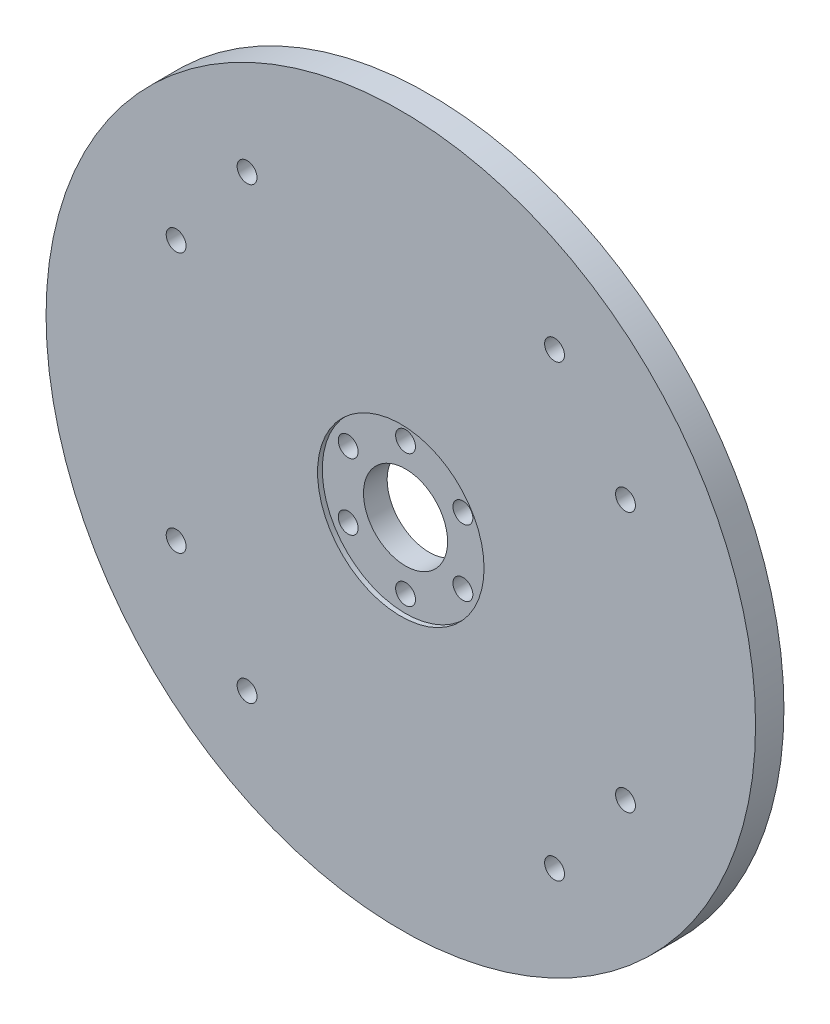
ISO-10303-21;
HEADER;
FILE_DESCRIPTION(('STEP AP214'),'2;1');
FILE_NAME('part.step','',(''),(''),'','','');
FILE_SCHEMA(('AUTOMOTIVE_DESIGN { 1 0 10303 214 1 1 1 1 }'));
ENDSEC;
DATA;
#1=APPLICATION_CONTEXT('core data for automotive mechanical design processes');
#2=APPLICATION_PROTOCOL_DEFINITION('international standard','automotive_design',2000,#1);
#3=PRODUCT_CONTEXT('',#1,'mechanical');
#4=PRODUCT('Part','Part','',(#3));
#5=PRODUCT_RELATED_PRODUCT_CATEGORY('part','',(#4));
#6=PRODUCT_DEFINITION_FORMATION('','',#4);
#7=PRODUCT_DEFINITION_CONTEXT('part definition',#1,'design');
#8=PRODUCT_DEFINITION('design','',#6,#7);
#9=PRODUCT_DEFINITION_SHAPE('','',#8);
#10=(LENGTH_UNIT() NAMED_UNIT(*) SI_UNIT(.MILLI.,.METRE.));
#11=(NAMED_UNIT(*) PLANE_ANGLE_UNIT() SI_UNIT($,.RADIAN.));
#12=(NAMED_UNIT(*) SI_UNIT($,.STERADIAN.) SOLID_ANGLE_UNIT());
#13=UNCERTAINTY_MEASURE_WITH_UNIT(LENGTH_MEASURE(1.E-05),#10,'distance_accuracy_value','');
#14=(GEOMETRIC_REPRESENTATION_CONTEXT(3) GLOBAL_UNCERTAINTY_ASSIGNED_CONTEXT((#13)) GLOBAL_UNIT_ASSIGNED_CONTEXT((#10,
#11,#12)) REPRESENTATION_CONTEXT('',''));
#15=CARTESIAN_POINT('',(0.,0.,0.));
#16=DIRECTION('',(0.,0.,1.));
#17=DIRECTION('',(1.,0.,0.));
#18=AXIS2_PLACEMENT_3D('',#15,#16,#17);
#19=CARTESIAN_POINT('',(-12.1243556529822,6.99999999999997,10.));
#20=DIRECTION('',(0.,0.,-1.));
#21=DIRECTION('',(-1.,0.,0.));
#22=AXIS2_PLACEMENT_3D('',#19,#20,#21);
#23=CYLINDRICAL_SURFACE('',#22,2.1);
#24=CARTESIAN_POINT('',(-12.1243556529822,6.99999999999997,0.999999999999999));
#25=DIRECTION('',(0.,0.,1.));
#26=DIRECTION('',(1.,0.,0.));
#27=AXIS2_PLACEMENT_3D('',#24,#25,#26);
#28=CIRCLE('',#27,2.1);
#29=CARTESIAN_POINT('',(-10.0243556529822,6.99999999999997,0.999999999999999));
#30=VERTEX_POINT('',#29);
#31=EDGE_CURVE('E53',#30,#30,#28,.F.);
#32=ORIENTED_EDGE('',*,*,#31,.F.);
#33=EDGE_LOOP('',(#32));
#34=FACE_BOUND('',#33,.T.);
#35=CARTESIAN_POINT('',(-12.1243556529822,6.99999999999997,-4.));
#36=DIRECTION('',(0.,0.,-1.));
#37=DIRECTION('',(-1.,0.,0.));
#38=AXIS2_PLACEMENT_3D('',#35,#36,#37);
#39=CIRCLE('',#38,2.1);
#40=CARTESIAN_POINT('',(-14.2243556529822,6.99999999999997,-4.));
#41=VERTEX_POINT('',#40);
#42=EDGE_CURVE('E143',#41,#41,#39,.T.);
#43=ORIENTED_EDGE('',*,*,#42,.T.);
#44=EDGE_LOOP('',(#43));
#45=FACE_BOUND('',#44,.T.);
#46=ADVANCED_FACE('F44',(#34,#45),#23,.F.);
#47=CARTESIAN_POINT('',(-12.1243556529821,-7.00000000000006,10.));
#48=DIRECTION('',(0.,0.,-1.));
#49=DIRECTION('',(-1.,0.,0.));
#50=AXIS2_PLACEMENT_3D('',#47,#48,#49);
#51=CYLINDRICAL_SURFACE('',#50,2.1);
#52=CARTESIAN_POINT('',(-12.1243556529821,-7.00000000000006,0.999999999999999));
#53=DIRECTION('',(0.,0.,1.));
#54=DIRECTION('',(1.,0.,0.));
#55=AXIS2_PLACEMENT_3D('',#52,#53,#54);
#56=CIRCLE('',#55,2.1);
#57=CARTESIAN_POINT('',(-10.0243556529821,-7.00000000000006,0.999999999999999));
#58=VERTEX_POINT('',#57);
#59=EDGE_CURVE('E56',#58,#58,#56,.F.);
#60=ORIENTED_EDGE('',*,*,#59,.F.);
#61=EDGE_LOOP('',(#60));
#62=FACE_BOUND('',#61,.T.);
#63=CARTESIAN_POINT('',(-12.1243556529821,-7.00000000000006,-4.));
#64=DIRECTION('',(0.,0.,-1.));
#65=DIRECTION('',(-1.,0.,0.));
#66=AXIS2_PLACEMENT_3D('',#63,#64,#65);
#67=CIRCLE('',#66,2.1);
#68=CARTESIAN_POINT('',(-14.2243556529821,-7.00000000000006,-4.));
#69=VERTEX_POINT('',#68);
#70=EDGE_CURVE('E142',#69,#69,#67,.T.);
#71=ORIENTED_EDGE('',*,*,#70,.T.);
#72=EDGE_LOOP('',(#71));
#73=FACE_BOUND('',#72,.T.);
#74=ADVANCED_FACE('F204',(#62,#73),#51,.F.);
#75=CARTESIAN_POINT('',(0.,-14.,10.));
#76=DIRECTION('',(0.,0.,-1.));
#77=DIRECTION('',(-1.,0.,0.));
#78=AXIS2_PLACEMENT_3D('',#75,#76,#77);
#79=CYLINDRICAL_SURFACE('',#78,2.1);
#80=CARTESIAN_POINT('',(0.,-14.,0.999999999999999));
#81=DIRECTION('',(0.,0.,1.));
#82=DIRECTION('',(1.,0.,0.));
#83=AXIS2_PLACEMENT_3D('',#80,#81,#82);
#84=CIRCLE('',#83,2.1);
#85=CARTESIAN_POINT('',(2.1000000000001,-14.,0.999999999999999));
#86=VERTEX_POINT('',#85);
#87=EDGE_CURVE('E65',#86,#86,#84,.F.);
#88=ORIENTED_EDGE('',*,*,#87,.F.);
#89=EDGE_LOOP('',(#88));
#90=FACE_BOUND('',#89,.T.);
#91=CARTESIAN_POINT('',(0.,-14.,-4.));
#92=DIRECTION('',(0.,0.,-1.));
#93=DIRECTION('',(-1.,0.,0.));
#94=AXIS2_PLACEMENT_3D('',#91,#92,#93);
#95=CIRCLE('',#94,2.1);
#96=CARTESIAN_POINT('',(-2.0999999999999,-14.,-4.));
#97=VERTEX_POINT('',#96);
#98=EDGE_CURVE('E137',#97,#97,#95,.T.);
#99=ORIENTED_EDGE('',*,*,#98,.T.);
#100=EDGE_LOOP('',(#99));
#101=FACE_BOUND('',#100,.T.);
#102=ADVANCED_FACE('F208',(#90,#101),#79,.F.);
#103=CARTESIAN_POINT('',(12.1243556529822,-6.99999999999989,10.));
#104=DIRECTION('',(0.,0.,-1.));
#105=DIRECTION('',(-1.,0.,0.));
#106=AXIS2_PLACEMENT_3D('',#103,#104,#105);
#107=CYLINDRICAL_SURFACE('',#106,2.1);
#108=CARTESIAN_POINT('',(12.1243556529822,-6.99999999999989,0.999999999999999));
#109=DIRECTION('',(0.,0.,1.));
#110=DIRECTION('',(1.,0.,0.));
#111=AXIS2_PLACEMENT_3D('',#108,#109,#110);
#112=CIRCLE('',#111,2.1);
#113=CARTESIAN_POINT('',(14.2243556529822,-6.99999999999989,0.999999999999999));
#114=VERTEX_POINT('',#113);
#115=EDGE_CURVE('E68',#114,#114,#112,.F.);
#116=ORIENTED_EDGE('',*,*,#115,.F.);
#117=EDGE_LOOP('',(#116));
#118=FACE_BOUND('',#117,.T.);
#119=CARTESIAN_POINT('',(12.1243556529822,-6.99999999999989,-4.));
#120=DIRECTION('',(0.,0.,-1.));
#121=DIRECTION('',(-1.,0.,0.));
#122=AXIS2_PLACEMENT_3D('',#119,#120,#121);
#123=CIRCLE('',#122,2.1);
#124=CARTESIAN_POINT('',(10.0243556529822,-6.99999999999989,-4.));
#125=VERTEX_POINT('',#124);
#126=EDGE_CURVE('E134',#125,#125,#123,.T.);
#127=ORIENTED_EDGE('',*,*,#126,.T.);
#128=EDGE_LOOP('',(#127));
#129=FACE_BOUND('',#128,.T.);
#130=ADVANCED_FACE('F220',(#118,#129),#107,.F.);
#131=CARTESIAN_POINT('',(12.1243556529821,7.00000000000014,10.));
#132=DIRECTION('',(0.,0.,-1.));
#133=DIRECTION('',(-1.,0.,0.));
#134=AXIS2_PLACEMENT_3D('',#131,#132,#133);
#135=CYLINDRICAL_SURFACE('',#134,2.1);
#136=CARTESIAN_POINT('',(12.1243556529821,7.00000000000014,0.999999999999999));
#137=DIRECTION('',(0.,0.,1.));
#138=DIRECTION('',(1.,0.,0.));
#139=AXIS2_PLACEMENT_3D('',#136,#137,#138);
#140=CIRCLE('',#139,2.1);
#141=CARTESIAN_POINT('',(14.2243556529821,7.00000000000014,0.999999999999999));
#142=VERTEX_POINT('',#141);
#143=EDGE_CURVE('E74',#142,#142,#140,.F.);
#144=ORIENTED_EDGE('',*,*,#143,.F.);
#145=EDGE_LOOP('',(#144));
#146=FACE_BOUND('',#145,.T.);
#147=CARTESIAN_POINT('',(12.1243556529821,7.00000000000014,-4.));
#148=DIRECTION('',(0.,0.,-1.));
#149=DIRECTION('',(-1.,0.,0.));
#150=AXIS2_PLACEMENT_3D('',#147,#148,#149);
#151=CIRCLE('',#150,2.1);
#152=CARTESIAN_POINT('',(10.0243556529821,7.00000000000014,-4.));
#153=VERTEX_POINT('',#152);
#154=EDGE_CURVE('E128',#153,#153,#151,.T.);
#155=ORIENTED_EDGE('',*,*,#154,.T.);
#156=EDGE_LOOP('',(#155));
#157=FACE_BOUND('',#156,.T.);
#158=ADVANCED_FACE('F216',(#146,#157),#135,.F.);
#159=CARTESIAN_POINT('',(0.,14.,10.));
#160=DIRECTION('',(0.,0.,-1.));
#161=DIRECTION('',(-1.,0.,0.));
#162=AXIS2_PLACEMENT_3D('',#159,#160,#161);
#163=CYLINDRICAL_SURFACE('',#162,2.1);
#164=CARTESIAN_POINT('',(0.,14.,0.999999999999999));
#165=DIRECTION('',(0.,0.,1.));
#166=DIRECTION('',(1.,0.,0.));
#167=AXIS2_PLACEMENT_3D('',#164,#165,#166);
#168=CIRCLE('',#167,2.1);
#169=CARTESIAN_POINT('',(2.1,14.,0.999999999999999));
#170=VERTEX_POINT('',#169);
#171=EDGE_CURVE('E80',#170,#170,#168,.F.);
#172=ORIENTED_EDGE('',*,*,#171,.F.);
#173=EDGE_LOOP('',(#172));
#174=FACE_BOUND('',#173,.T.);
#175=CARTESIAN_POINT('',(0.,14.,-4.));
#176=DIRECTION('',(0.,0.,-1.));
#177=DIRECTION('',(-1.,0.,0.));
#178=AXIS2_PLACEMENT_3D('',#175,#176,#177);
#179=CIRCLE('',#178,2.1);
#180=CARTESIAN_POINT('',(-2.1,14.,-4.));
#181=VERTEX_POINT('',#180);
#182=EDGE_CURVE('E148',#181,#181,#179,.T.);
#183=ORIENTED_EDGE('',*,*,#182,.T.);
#184=EDGE_LOOP('',(#183));
#185=FACE_BOUND('',#184,.T.);
#186=ADVANCED_FACE('F227',(#174,#185),#163,.F.);
#187=CARTESIAN_POINT('',(0.,0.,17.));
#188=DIRECTION('',(0.,0.,-1.));
#189=DIRECTION('',(-1.,0.,0.));
#190=AXIS2_PLACEMENT_3D('',#187,#188,#189);
#191=CYLINDRICAL_SURFACE('',#190,8.88835894183931);
#192=CARTESIAN_POINT('',(0.,0.,1.));
#193=DIRECTION('',(0.,0.,1.));
#194=DIRECTION('',(1.,0.,0.));
#195=AXIS2_PLACEMENT_3D('',#192,#193,#194);
#196=CIRCLE('',#195,8.88835894183931);
#197=CARTESIAN_POINT('',(8.88835894183931,0.,1.));
#198=VERTEX_POINT('',#197);
#199=EDGE_CURVE('E47',#198,#198,#196,.F.);
#200=ORIENTED_EDGE('',*,*,#199,.F.);
#201=EDGE_LOOP('',(#200));
#202=FACE_BOUND('',#201,.T.);
#203=CARTESIAN_POINT('',(0.,0.,-4.));
#204=DIRECTION('',(0.,0.,-1.));
#205=DIRECTION('',(-1.,0.,0.));
#206=AXIS2_PLACEMENT_3D('',#203,#204,#205);
#207=CIRCLE('',#206,8.88835894183931);
#208=CARTESIAN_POINT('',(-8.88835894183931,0.,-4.));
#209=VERTEX_POINT('',#208);
#210=EDGE_CURVE('E123',#209,#209,#207,.T.);
#211=ORIENTED_EDGE('',*,*,#210,.T.);
#212=EDGE_LOOP('',(#211));
#213=FACE_BOUND('',#212,.T.);
#214=ADVANCED_FACE('F274',(#202,#213),#191,.F.);
#215=CARTESIAN_POINT('',(0.,0.,2.));
#216=DIRECTION('',(0.,0.,1.));
#217=DIRECTION('',(1.,0.,0.));
#218=AXIS2_PLACEMENT_3D('',#215,#216,#217);
#219=PLANE('',#218);
#220=CARTESIAN_POINT('',(47.5,-27.5,2.));
#221=DIRECTION('',(0.,0.,1.));
#222=DIRECTION('',(1.,0.,0.));
#223=AXIS2_PLACEMENT_3D('',#220,#221,#222);
#224=CIRCLE('',#223,2.1);
#225=CARTESIAN_POINT('',(49.6,-27.5,2.));
#226=VERTEX_POINT('',#225);
#227=EDGE_CURVE('E102',#226,#226,#224,.T.);
#228=ORIENTED_EDGE('',*,*,#227,.F.);
#229=EDGE_LOOP('',(#228));
#230=FACE_BOUND('',#229,.T.);
#231=CARTESIAN_POINT('',(-47.5,-27.5,2.));
#232=DIRECTION('',(0.,0.,1.));
#233=DIRECTION('',(1.,0.,0.));
#234=AXIS2_PLACEMENT_3D('',#231,#232,#233);
#235=CIRCLE('',#234,2.1);
#236=CARTESIAN_POINT('',(-45.4,-27.5,2.));
#237=VERTEX_POINT('',#236);
#238=EDGE_CURVE('E107',#237,#237,#235,.T.);
#239=ORIENTED_EDGE('',*,*,#238,.F.);
#240=EDGE_LOOP('',(#239));
#241=FACE_BOUND('',#240,.T.);
#242=CARTESIAN_POINT('',(-47.5,27.5,2.));
#243=DIRECTION('',(0.,0.,1.));
#244=DIRECTION('',(1.,0.,0.));
#245=AXIS2_PLACEMENT_3D('',#242,#243,#244);
#246=CIRCLE('',#245,2.1);
#247=CARTESIAN_POINT('',(-45.4,27.5,2.));
#248=VERTEX_POINT('',#247);
#249=EDGE_CURVE('E113',#248,#248,#246,.T.);
#250=ORIENTED_EDGE('',*,*,#249,.F.);
#251=EDGE_LOOP('',(#250));
#252=FACE_BOUND('',#251,.T.);
#253=CARTESIAN_POINT('',(47.5,27.5,2.));
#254=DIRECTION('',(0.,0.,1.));
#255=DIRECTION('',(1.,0.,0.));
#256=AXIS2_PLACEMENT_3D('',#253,#254,#255);
#257=CIRCLE('',#256,2.1);
#258=CARTESIAN_POINT('',(49.6,27.5,2.));
#259=VERTEX_POINT('',#258);
#260=EDGE_CURVE('E120',#259,#259,#257,.T.);
#261=ORIENTED_EDGE('',*,*,#260,.F.);
#262=EDGE_LOOP('',(#261));
#263=FACE_BOUND('',#262,.T.);
#264=CARTESIAN_POINT('',(32.5,-47.5,2.));
#265=DIRECTION('',(0.,0.,1.));
#266=DIRECTION('',(1.,0.,0.));
#267=AXIS2_PLACEMENT_3D('',#264,#265,#266);
#268=CIRCLE('',#267,2.1);
#269=CARTESIAN_POINT('',(34.6,-47.5,2.));
#270=VERTEX_POINT('',#269);
#271=EDGE_CURVE('E86',#270,#270,#268,.T.);
#272=ORIENTED_EDGE('',*,*,#271,.F.);
#273=EDGE_LOOP('',(#272));
#274=FACE_BOUND('',#273,.T.);
#275=CARTESIAN_POINT('',(-32.5,-47.5,2.));
#276=DIRECTION('',(0.,0.,1.));
#277=DIRECTION('',(1.,0.,0.));
#278=AXIS2_PLACEMENT_3D('',#275,#276,#277);
#279=CIRCLE('',#278,2.1);
#280=CARTESIAN_POINT('',(-30.4,-47.5,2.));
#281=VERTEX_POINT('',#280);
#282=EDGE_CURVE('E94',#281,#281,#279,.T.);
#283=ORIENTED_EDGE('',*,*,#282,.F.);
#284=EDGE_LOOP('',(#283));
#285=FACE_BOUND('',#284,.T.);
#286=CARTESIAN_POINT('',(-32.5,47.5,2.));
#287=DIRECTION('',(0.,0.,1.));
#288=DIRECTION('',(1.,0.,0.));
#289=AXIS2_PLACEMENT_3D('',#286,#287,#288);
#290=CIRCLE('',#289,2.1);
#291=CARTESIAN_POINT('',(-30.4,47.5,2.));
#292=VERTEX_POINT('',#291);
#293=EDGE_CURVE('E97',#292,#292,#290,.T.);
#294=ORIENTED_EDGE('',*,*,#293,.F.);
#295=EDGE_LOOP('',(#294));
#296=FACE_BOUND('',#295,.T.);
#297=CARTESIAN_POINT('',(32.5,47.5,2.));
#298=DIRECTION('',(0.,0.,1.));
#299=DIRECTION('',(1.,0.,0.));
#300=AXIS2_PLACEMENT_3D('',#297,#298,#299);
#301=CIRCLE('',#300,2.1);
#302=CARTESIAN_POINT('',(34.6,47.5,2.));
#303=VERTEX_POINT('',#302);
#304=EDGE_CURVE('E103',#303,#303,#301,.T.);
#305=ORIENTED_EDGE('',*,*,#304,.F.);
#306=EDGE_LOOP('',(#305));
#307=FACE_BOUND('',#306,.T.);
#308=CARTESIAN_POINT('',(0.,0.,2.));
#309=DIRECTION('',(0.,0.,1.));
#310=DIRECTION('',(1.,0.,0.));
#311=AXIS2_PLACEMENT_3D('',#308,#309,#310);
#312=CIRCLE('',#311,17.6);
#313=CARTESIAN_POINT('',(17.6,0.,2.));
#314=VERTEX_POINT('',#313);
#315=EDGE_CURVE('E81',#314,#314,#312,.T.);
#316=ORIENTED_EDGE('',*,*,#315,.F.);
#317=EDGE_LOOP('',(#316));
#318=FACE_BOUND('',#317,.T.);
#319=CARTESIAN_POINT('',(0.,0.,2.));
#320=DIRECTION('',(0.,0.,-1.));
#321=DIRECTION('',(-1.,0.,0.));
#322=AXIS2_PLACEMENT_3D('',#319,#320,#321);
#323=CIRCLE('',#322,75.);
#324=CARTESIAN_POINT('',(-75.,0.,2.));
#325=VERTEX_POINT('',#324);
#326=EDGE_CURVE('E10',#325,#325,#323,.T.);
#327=ORIENTED_EDGE('',*,*,#326,.F.);
#328=EDGE_LOOP('',(#327));
#329=FACE_BOUND('',#328,.T.);
#330=ADVANCED_FACE('F50',(#230,#241,#252,#263,#274,#285,#296,#307,#318,#329),#219,.T.);
#331=CARTESIAN_POINT('',(0.,0.,2.));
#332=DIRECTION('',(0.,0.,-1.));
#333=DIRECTION('',(-1.,0.,0.));
#334=AXIS2_PLACEMENT_3D('',#331,#332,#333);
#335=CYLINDRICAL_SURFACE('',#334,75.);
#336=ORIENTED_EDGE('',*,*,#326,.T.);
#337=EDGE_LOOP('',(#336));
#338=FACE_BOUND('',#337,.T.);
#339=CARTESIAN_POINT('',(0.,0.,-4.));
#340=DIRECTION('',(0.,0.,-1.));
#341=DIRECTION('',(-1.,0.,0.));
#342=AXIS2_PLACEMENT_3D('',#339,#340,#341);
#343=CIRCLE('',#342,75.);
#344=CARTESIAN_POINT('',(-75.,0.,-4.));
#345=VERTEX_POINT('',#344);
#346=EDGE_CURVE('E122',#345,#345,#343,.T.);
#347=ORIENTED_EDGE('',*,*,#346,.F.);
#348=EDGE_LOOP('',(#347));
#349=FACE_BOUND('',#348,.T.);
#350=ADVANCED_FACE('F275',(#338,#349),#335,.T.);
#351=CARTESIAN_POINT('',(0.,0.,1.));
#352=DIRECTION('',(0.,0.,1.));
#353=DIRECTION('',(1.,0.,0.));
#354=AXIS2_PLACEMENT_3D('',#351,#352,#353);
#355=PLANE('',#354);
#356=ORIENTED_EDGE('',*,*,#199,.T.);
#357=EDGE_LOOP('',(#356));
#358=FACE_BOUND('',#357,.T.);
#359=ORIENTED_EDGE('',*,*,#171,.T.);
#360=EDGE_LOOP('',(#359));
#361=FACE_BOUND('',#360,.T.);
#362=ORIENTED_EDGE('',*,*,#143,.T.);
#363=EDGE_LOOP('',(#362));
#364=FACE_BOUND('',#363,.T.);
#365=ORIENTED_EDGE('',*,*,#115,.T.);
#366=EDGE_LOOP('',(#365));
#367=FACE_BOUND('',#366,.T.);
#368=ORIENTED_EDGE('',*,*,#87,.T.);
#369=EDGE_LOOP('',(#368));
#370=FACE_BOUND('',#369,.T.);
#371=ORIENTED_EDGE('',*,*,#59,.T.);
#372=EDGE_LOOP('',(#371));
#373=FACE_BOUND('',#372,.T.);
#374=ORIENTED_EDGE('',*,*,#31,.T.);
#375=EDGE_LOOP('',(#374));
#376=FACE_BOUND('',#375,.T.);
#377=CARTESIAN_POINT('',(0.,0.,1.));
#378=DIRECTION('',(0.,0.,1.));
#379=DIRECTION('',(1.,0.,0.));
#380=AXIS2_PLACEMENT_3D('',#377,#378,#379);
#381=CIRCLE('',#380,17.6);
#382=CARTESIAN_POINT('',(17.6,0.,1.));
#383=VERTEX_POINT('',#382);
#384=EDGE_CURVE('E85',#383,#383,#381,.T.);
#385=ORIENTED_EDGE('',*,*,#384,.T.);
#386=EDGE_LOOP('',(#385));
#387=FACE_BOUND('',#386,.T.);
#388=ADVANCED_FACE('F269',(#358,#361,#364,#367,#370,#373,#376,#387),#355,.T.);
#389=CARTESIAN_POINT('',(0.,0.,1.));
#390=DIRECTION('',(0.,0.,1.));
#391=DIRECTION('',(1.,0.,0.));
#392=AXIS2_PLACEMENT_3D('',#389,#390,#391);
#393=CYLINDRICAL_SURFACE('',#392,17.6);
#394=ORIENTED_EDGE('',*,*,#384,.F.);
#395=EDGE_LOOP('',(#394));
#396=FACE_BOUND('',#395,.T.);
#397=ORIENTED_EDGE('',*,*,#315,.T.);
#398=EDGE_LOOP('',(#397));
#399=FACE_BOUND('',#398,.T.);
#400=ADVANCED_FACE('F263',(#396,#399),#393,.F.);
#401=CARTESIAN_POINT('',(32.5,47.5,10.));
#402=DIRECTION('',(0.,0.,-1.));
#403=DIRECTION('',(-1.,0.,0.));
#404=AXIS2_PLACEMENT_3D('',#401,#402,#403);
#405=CYLINDRICAL_SURFACE('',#404,2.1);
#406=ORIENTED_EDGE('',*,*,#304,.T.);
#407=EDGE_LOOP('',(#406));
#408=FACE_BOUND('',#407,.T.);
#409=CARTESIAN_POINT('',(32.5,47.5,-4.));
#410=DIRECTION('',(0.,0.,-1.));
#411=DIRECTION('',(-1.,0.,0.));
#412=AXIS2_PLACEMENT_3D('',#409,#410,#411);
#413=CIRCLE('',#412,2.1);
#414=CARTESIAN_POINT('',(30.4,47.5,-4.));
#415=VERTEX_POINT('',#414);
#416=EDGE_CURVE('E181',#415,#415,#413,.T.);
#417=ORIENTED_EDGE('',*,*,#416,.T.);
#418=EDGE_LOOP('',(#417));
#419=FACE_BOUND('',#418,.T.);
#420=ADVANCED_FACE('F187',(#408,#419),#405,.F.);
#421=CARTESIAN_POINT('',(-32.5,47.5,10.));
#422=DIRECTION('',(0.,0.,-1.));
#423=DIRECTION('',(-1.,0.,0.));
#424=AXIS2_PLACEMENT_3D('',#421,#422,#423);
#425=CYLINDRICAL_SURFACE('',#424,2.1);
#426=ORIENTED_EDGE('',*,*,#293,.T.);
#427=EDGE_LOOP('',(#426));
#428=FACE_BOUND('',#427,.T.);
#429=CARTESIAN_POINT('',(-32.5,47.5,-4.));
#430=DIRECTION('',(0.,0.,-1.));
#431=DIRECTION('',(-1.,0.,0.));
#432=AXIS2_PLACEMENT_3D('',#429,#430,#431);
#433=CIRCLE('',#432,2.1);
#434=CARTESIAN_POINT('',(-34.6,47.5,-4.));
#435=VERTEX_POINT('',#434);
#436=EDGE_CURVE('E154',#435,#435,#433,.T.);
#437=ORIENTED_EDGE('',*,*,#436,.T.);
#438=EDGE_LOOP('',(#437));
#439=FACE_BOUND('',#438,.T.);
#440=ADVANCED_FACE('F247',(#428,#439),#425,.F.);
#441=CARTESIAN_POINT('',(-32.5,-47.5,10.));
#442=DIRECTION('',(0.,0.,-1.));
#443=DIRECTION('',(-1.,0.,0.));
#444=AXIS2_PLACEMENT_3D('',#441,#442,#443);
#445=CYLINDRICAL_SURFACE('',#444,2.1);
#446=ORIENTED_EDGE('',*,*,#282,.T.);
#447=EDGE_LOOP('',(#446));
#448=FACE_BOUND('',#447,.T.);
#449=CARTESIAN_POINT('',(-32.5,-47.5,-4.));
#450=DIRECTION('',(0.,0.,-1.));
#451=DIRECTION('',(-1.,0.,0.));
#452=AXIS2_PLACEMENT_3D('',#449,#450,#451);
#453=CIRCLE('',#452,2.1);
#454=CARTESIAN_POINT('',(-34.6,-47.5,-4.));
#455=VERTEX_POINT('',#454);
#456=EDGE_CURVE('E164',#455,#455,#453,.T.);
#457=ORIENTED_EDGE('',*,*,#456,.T.);
#458=EDGE_LOOP('',(#457));
#459=FACE_BOUND('',#458,.T.);
#460=ADVANCED_FACE('F244',(#448,#459),#445,.F.);
#461=CARTESIAN_POINT('',(32.5,-47.5,10.));
#462=DIRECTION('',(0.,0.,-1.));
#463=DIRECTION('',(-1.,0.,0.));
#464=AXIS2_PLACEMENT_3D('',#461,#462,#463);
#465=CYLINDRICAL_SURFACE('',#464,2.1);
#466=ORIENTED_EDGE('',*,*,#271,.T.);
#467=EDGE_LOOP('',(#466));
#468=FACE_BOUND('',#467,.T.);
#469=CARTESIAN_POINT('',(32.5,-47.5,-4.));
#470=DIRECTION('',(0.,0.,-1.));
#471=DIRECTION('',(-1.,0.,0.));
#472=AXIS2_PLACEMENT_3D('',#469,#470,#471);
#473=CIRCLE('',#472,2.1);
#474=CARTESIAN_POINT('',(30.4,-47.5,-4.));
#475=VERTEX_POINT('',#474);
#476=EDGE_CURVE('E169',#475,#475,#473,.T.);
#477=ORIENTED_EDGE('',*,*,#476,.T.);
#478=EDGE_LOOP('',(#477));
#479=FACE_BOUND('',#478,.T.);
#480=ADVANCED_FACE('F250',(#468,#479),#465,.F.);
#481=CARTESIAN_POINT('',(47.5,27.5,10.));
#482=DIRECTION('',(0.,0.,-1.));
#483=DIRECTION('',(-1.,0.,0.));
#484=AXIS2_PLACEMENT_3D('',#481,#482,#483);
#485=CYLINDRICAL_SURFACE('',#484,2.1);
#486=ORIENTED_EDGE('',*,*,#260,.T.);
#487=EDGE_LOOP('',(#486));
#488=FACE_BOUND('',#487,.T.);
#489=CARTESIAN_POINT('',(47.5,27.5,-4.));
#490=DIRECTION('',(0.,0.,-1.));
#491=DIRECTION('',(-1.,0.,0.));
#492=AXIS2_PLACEMENT_3D('',#489,#490,#491);
#493=CIRCLE('',#492,2.1);
#494=CARTESIAN_POINT('',(45.4,27.5,-4.));
#495=VERTEX_POINT('',#494);
#496=EDGE_CURVE('E180',#495,#495,#493,.T.);
#497=ORIENTED_EDGE('',*,*,#496,.T.);
#498=EDGE_LOOP('',(#497));
#499=FACE_BOUND('',#498,.T.);
#500=ADVANCED_FACE('F253',(#488,#499),#485,.F.);
#501=CARTESIAN_POINT('',(-47.5,27.5,10.));
#502=DIRECTION('',(0.,0.,-1.));
#503=DIRECTION('',(-1.,0.,0.));
#504=AXIS2_PLACEMENT_3D('',#501,#502,#503);
#505=CYLINDRICAL_SURFACE('',#504,2.1);
#506=ORIENTED_EDGE('',*,*,#249,.T.);
#507=EDGE_LOOP('',(#506));
#508=FACE_BOUND('',#507,.T.);
#509=CARTESIAN_POINT('',(-47.5,27.5,-4.));
#510=DIRECTION('',(0.,0.,-1.));
#511=DIRECTION('',(-1.,0.,0.));
#512=AXIS2_PLACEMENT_3D('',#509,#510,#511);
#513=CIRCLE('',#512,2.1);
#514=CARTESIAN_POINT('',(-49.6,27.5,-4.));
#515=VERTEX_POINT('',#514);
#516=EDGE_CURVE('E157',#515,#515,#513,.T.);
#517=ORIENTED_EDGE('',*,*,#516,.T.);
#518=EDGE_LOOP('',(#517));
#519=FACE_BOUND('',#518,.T.);
#520=ADVANCED_FACE('F341',(#508,#519),#505,.F.);
#521=CARTESIAN_POINT('',(-47.5,-27.5,10.));
#522=DIRECTION('',(0.,0.,-1.));
#523=DIRECTION('',(-1.,0.,0.));
#524=AXIS2_PLACEMENT_3D('',#521,#522,#523);
#525=CYLINDRICAL_SURFACE('',#524,2.1);
#526=ORIENTED_EDGE('',*,*,#238,.T.);
#527=EDGE_LOOP('',(#526));
#528=FACE_BOUND('',#527,.T.);
#529=CARTESIAN_POINT('',(-47.5,-27.5,-4.));
#530=DIRECTION('',(0.,0.,-1.));
#531=DIRECTION('',(-1.,0.,0.));
#532=AXIS2_PLACEMENT_3D('',#529,#530,#531);
#533=CIRCLE('',#532,2.1);
#534=CARTESIAN_POINT('',(-49.6,-27.5,-4.));
#535=VERTEX_POINT('',#534);
#536=EDGE_CURVE('E163',#535,#535,#533,.T.);
#537=ORIENTED_EDGE('',*,*,#536,.T.);
#538=EDGE_LOOP('',(#537));
#539=FACE_BOUND('',#538,.T.);
#540=ADVANCED_FACE('F196',(#528,#539),#525,.F.);
#541=CARTESIAN_POINT('',(47.5,-27.5,10.));
#542=DIRECTION('',(0.,0.,-1.));
#543=DIRECTION('',(-1.,0.,0.));
#544=AXIS2_PLACEMENT_3D('',#541,#542,#543);
#545=CYLINDRICAL_SURFACE('',#544,2.1);
#546=ORIENTED_EDGE('',*,*,#227,.T.);
#547=EDGE_LOOP('',(#546));
#548=FACE_BOUND('',#547,.T.);
#549=CARTESIAN_POINT('',(47.5,-27.5,-4.));
#550=DIRECTION('',(0.,0.,-1.));
#551=DIRECTION('',(-1.,0.,0.));
#552=AXIS2_PLACEMENT_3D('',#549,#550,#551);
#553=CIRCLE('',#552,2.1);
#554=CARTESIAN_POINT('',(45.4,-27.5,-4.));
#555=VERTEX_POINT('',#554);
#556=EDGE_CURVE('E173',#555,#555,#553,.T.);
#557=ORIENTED_EDGE('',*,*,#556,.T.);
#558=EDGE_LOOP('',(#557));
#559=FACE_BOUND('',#558,.T.);
#560=ADVANCED_FACE('F188',(#548,#559),#545,.F.);
#561=CARTESIAN_POINT('',(0.,0.,-4.));
#562=DIRECTION('',(0.,0.,-1.));
#563=DIRECTION('',(-1.,0.,0.));
#564=AXIS2_PLACEMENT_3D('',#561,#562,#563);
#565=PLANE('',#564);
#566=ORIENTED_EDGE('',*,*,#496,.F.);
#567=EDGE_LOOP('',(#566));
#568=FACE_BOUND('',#567,.T.);
#569=ORIENTED_EDGE('',*,*,#476,.F.);
#570=EDGE_LOOP('',(#569));
#571=FACE_BOUND('',#570,.T.);
#572=ORIENTED_EDGE('',*,*,#536,.F.);
#573=EDGE_LOOP('',(#572));
#574=FACE_BOUND('',#573,.T.);
#575=ORIENTED_EDGE('',*,*,#436,.F.);
#576=EDGE_LOOP('',(#575));
#577=FACE_BOUND('',#576,.T.);
#578=ORIENTED_EDGE('',*,*,#42,.F.);
#579=EDGE_LOOP('',(#578));
#580=FACE_BOUND('',#579,.T.);
#581=ORIENTED_EDGE('',*,*,#98,.F.);
#582=EDGE_LOOP('',(#581));
#583=FACE_BOUND('',#582,.T.);
#584=ORIENTED_EDGE('',*,*,#154,.F.);
#585=EDGE_LOOP('',(#584));
#586=FACE_BOUND('',#585,.T.);
#587=ORIENTED_EDGE('',*,*,#346,.T.);
#588=EDGE_LOOP('',(#587));
#589=FACE_BOUND('',#588,.T.);
#590=ORIENTED_EDGE('',*,*,#210,.F.);
#591=EDGE_LOOP('',(#590));
#592=FACE_BOUND('',#591,.T.);
#593=ORIENTED_EDGE('',*,*,#126,.F.);
#594=EDGE_LOOP('',(#593));
#595=FACE_BOUND('',#594,.T.);
#596=ORIENTED_EDGE('',*,*,#70,.F.);
#597=EDGE_LOOP('',(#596));
#598=FACE_BOUND('',#597,.T.);
#599=ORIENTED_EDGE('',*,*,#182,.F.);
#600=EDGE_LOOP('',(#599));
#601=FACE_BOUND('',#600,.T.);
#602=ORIENTED_EDGE('',*,*,#516,.F.);
#603=EDGE_LOOP('',(#602));
#604=FACE_BOUND('',#603,.T.);
#605=ORIENTED_EDGE('',*,*,#456,.F.);
#606=EDGE_LOOP('',(#605));
#607=FACE_BOUND('',#606,.T.);
#608=ORIENTED_EDGE('',*,*,#556,.F.);
#609=EDGE_LOOP('',(#608));
#610=FACE_BOUND('',#609,.T.);
#611=ORIENTED_EDGE('',*,*,#416,.F.);
#612=EDGE_LOOP('',(#611));
#613=FACE_BOUND('',#612,.T.);
#614=ADVANCED_FACE('F189',(#568,#571,#574,#577,#580,#583,#586,#589,#592,#595,#598,#601,#604,
#607,#610,#613),#565,.T.);
#615=CLOSED_SHELL('',(#46,#74,#102,#130,#158,#186,#214,#330,#350,#388,#400,#420,#440,#460,#480,
#500,#520,#540,#560,#614));
#616=MANIFOLD_SOLID_BREP('B2',#615);
#617=ADVANCED_BREP_SHAPE_REPRESENTATION('',(#18,#616),#14);
#618=SHAPE_DEFINITION_REPRESENTATION(#9,#617);
ENDSEC;
END-ISO-10303-21;
